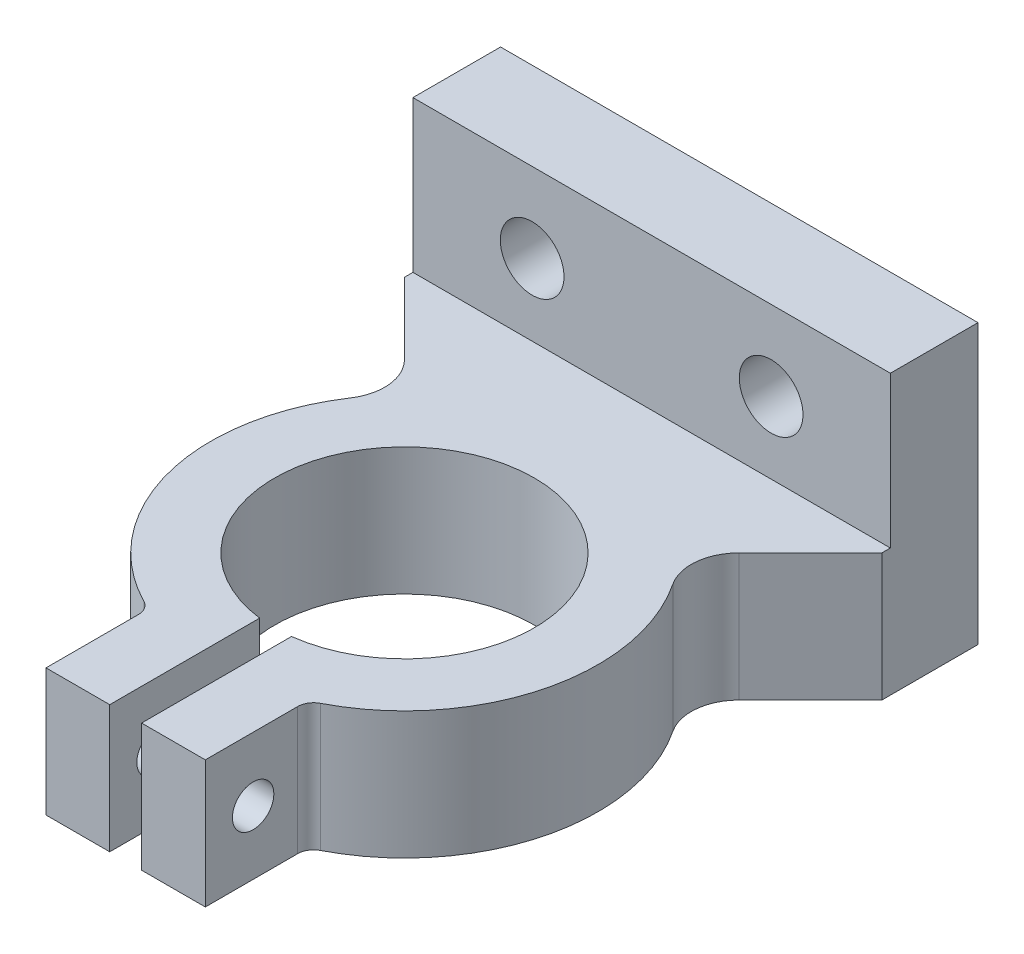
ISO-10303-21;
HEADER;
FILE_DESCRIPTION(('STEP AP214'),'2;1');
FILE_NAME('part.step','',(''),(''),'','','');
FILE_SCHEMA(('AUTOMOTIVE_DESIGN { 1 0 10303 214 1 1 1 1 }'));
ENDSEC;
DATA;
#1=APPLICATION_CONTEXT('core data for automotive mechanical design processes');
#2=APPLICATION_PROTOCOL_DEFINITION('international standard','automotive_design',2000,#1);
#3=PRODUCT_CONTEXT('',#1,'mechanical');
#4=PRODUCT('Part','Part','',(#3));
#5=PRODUCT_RELATED_PRODUCT_CATEGORY('part','',(#4));
#6=PRODUCT_DEFINITION_FORMATION('','',#4);
#7=PRODUCT_DEFINITION_CONTEXT('part definition',#1,'design');
#8=PRODUCT_DEFINITION('design','',#6,#7);
#9=PRODUCT_DEFINITION_SHAPE('','',#8);
#10=(LENGTH_UNIT() NAMED_UNIT(*) SI_UNIT(.MILLI.,.METRE.));
#11=(NAMED_UNIT(*) PLANE_ANGLE_UNIT() SI_UNIT($,.RADIAN.));
#12=(NAMED_UNIT(*) SI_UNIT($,.STERADIAN.) SOLID_ANGLE_UNIT());
#13=UNCERTAINTY_MEASURE_WITH_UNIT(LENGTH_MEASURE(1.E-05),#10,'distance_accuracy_value','');
#14=(GEOMETRIC_REPRESENTATION_CONTEXT(3) GLOBAL_UNCERTAINTY_ASSIGNED_CONTEXT((#13)) GLOBAL_UNIT_ASSIGNED_CONTEXT((#10,
#11,#12)) REPRESENTATION_CONTEXT('',''));
#15=CARTESIAN_POINT('',(0.,0.,0.));
#16=DIRECTION('',(0.,0.,1.));
#17=DIRECTION('',(1.,0.,0.));
#18=AXIS2_PLACEMENT_3D('',#15,#16,#17);
#19=CARTESIAN_POINT('',(0.,0.,0.));
#20=DIRECTION('',(0.,-1.,0.));
#21=DIRECTION('',(-1.,0.,0.));
#22=AXIS2_PLACEMENT_3D('',#19,#20,#21);
#23=PLANE('',#22);
#24=CARTESIAN_POINT('',(-25.2437120883597,0.,36.2415692858788));
#25=DIRECTION('',(0.,-1.,0.));
#26=DIRECTION('',(0.,0.,-1.));
#27=AXIS2_PLACEMENT_3D('',#24,#25,#26);
#28=CIRCLE('',#27,6.);
#29=CARTESIAN_POINT('',(-20.2449572193776,0.,39.560070417388));
#30=VERTEX_POINT('',#29);
#31=CARTESIAN_POINT('',(-21.0010714012405,0.,31.9989285987596));
#32=VERTEX_POINT('',#31);
#33=EDGE_CURVE('E344',#30,#32,#28,.F.);
#34=ORIENTED_EDGE('',*,*,#33,.T.);
#35=DIRECTION('',(-0.707106781186548,0.,-0.707106781186547));
#36=VECTOR('',#35,1.);
#37=CARTESIAN_POINT('',(-31.4662517628014,0.,21.5337482371987));
#38=LINE('',#37,#36);
#39=CARTESIAN_POINT('',(-29.9662517628014,0.,23.0337482371987));
#40=VERTEX_POINT('',#39);
#41=EDGE_CURVE('E230',#32,#40,#38,.T.);
#42=ORIENTED_EDGE('',*,*,#41,.T.);
#43=DIRECTION('',(0.,0.,-1.));
#44=VECTOR('',#43,1.);
#45=CARTESIAN_POINT('',(-29.9662517628014,0.,0.));
#46=LINE('',#45,#44);
#47=CARTESIAN_POINT('',(-29.9662517628014,0.,10.9737520097188));
#48=VERTEX_POINT('',#47);
#49=EDGE_CURVE('E367',#40,#48,#46,.T.);
#50=ORIENTED_EDGE('',*,*,#49,.T.);
#51=DIRECTION('',(-1.,0.,0.));
#52=VECTOR('',#51,1.);
#53=CARTESIAN_POINT('',(31.4662517628013,0.,10.9737520097188));
#54=LINE('',#53,#52);
#55=CARTESIAN_POINT('',(29.9662517628014,0.,10.9737520097188));
#56=VERTEX_POINT('',#55);
#57=EDGE_CURVE('E198',#56,#48,#54,.T.);
#58=ORIENTED_EDGE('',*,*,#57,.F.);
#59=DIRECTION('',(0.,0.,1.));
#60=VECTOR('',#59,1.);
#61=CARTESIAN_POINT('',(29.9662517628013,0.,0.));
#62=LINE('',#61,#60);
#63=CARTESIAN_POINT('',(29.9662517628014,0.,23.0337482371987));
#64=VERTEX_POINT('',#63);
#65=EDGE_CURVE('E446',#56,#64,#62,.T.);
#66=ORIENTED_EDGE('',*,*,#65,.T.);
#67=DIRECTION('',(0.707106781186548,0.,-0.707106781186547));
#68=VECTOR('',#67,1.);
#69=CARTESIAN_POINT('',(31.4662517628014,0.,21.5337482371987));
#70=LINE('',#69,#68);
#71=CARTESIAN_POINT('',(21.0010714012405,0.,31.9989285987596));
#72=VERTEX_POINT('',#71);
#73=EDGE_CURVE('E220',#72,#64,#70,.T.);
#74=ORIENTED_EDGE('',*,*,#73,.F.);
#75=CARTESIAN_POINT('',(25.2437120883597,0.,36.2415692858788));
#76=DIRECTION('',(0.,-1.,0.));
#77=DIRECTION('',(0.,0.,-1.));
#78=AXIS2_PLACEMENT_3D('',#75,#76,#77);
#79=CIRCLE('',#78,6.);
#80=CARTESIAN_POINT('',(20.2449572193776,0.,39.560070417388));
#81=VERTEX_POINT('',#80);
#82=EDGE_CURVE('E43',#72,#81,#79,.F.);
#83=ORIENTED_EDGE('',*,*,#82,.T.);
#84=CARTESIAN_POINT('',(0.,0.,53.));
#85=DIRECTION('',(0.,1.,0.));
#86=DIRECTION('',(0.,0.,1.));
#87=AXIS2_PLACEMENT_3D('',#84,#85,#86);
#88=CIRCLE('',#87,24.3);
#89=CARTESIAN_POINT('',(11.0874524714829,0.,74.6230987069987));
#90=VERTEX_POINT('',#89);
#91=EDGE_CURVE('E223',#90,#81,#88,.T.);
#92=ORIENTED_EDGE('',*,*,#91,.F.);
#93=CARTESIAN_POINT('',(12.,0.,76.4027776129245));
#94=DIRECTION('',(0.,-1.,0.));
#95=DIRECTION('',(0.,0.,-1.));
#96=AXIS2_PLACEMENT_3D('',#93,#94,#95);
#97=CIRCLE('',#96,2.);
#98=CARTESIAN_POINT('',(10.,0.,76.4027776129245));
#99=VERTEX_POINT('',#98);
#100=EDGE_CURVE('E295',#90,#99,#97,.F.);
#101=ORIENTED_EDGE('',*,*,#100,.T.);
#102=DIRECTION('',(0.,0.,-1.));
#103=VECTOR('',#102,1.);
#104=CARTESIAN_POINT('',(10.,0.,75.1470088273789));
#105=LINE('',#104,#103);
#106=CARTESIAN_POINT('',(10.,0.,88.));
#107=VERTEX_POINT('',#106);
#108=EDGE_CURVE('E333',#107,#99,#105,.T.);
#109=ORIENTED_EDGE('',*,*,#108,.F.);
#110=DIRECTION('',(1.,0.,0.));
#111=VECTOR('',#110,1.);
#112=CARTESIAN_POINT('',(2.,0.,88.));
#113=LINE('',#112,#111);
#114=CARTESIAN_POINT('',(2.,0.,88.));
#115=VERTEX_POINT('',#114);
#116=EDGE_CURVE('E245',#115,#107,#113,.T.);
#117=ORIENTED_EDGE('',*,*,#116,.F.);
#118=DIRECTION('',(0.,0.,1.));
#119=VECTOR('',#118,1.);
#120=CARTESIAN_POINT('',(2.,0.,69.1768352900065));
#121=LINE('',#120,#119);
#122=CARTESIAN_POINT('',(2.,0.,69.1768352900065));
#123=VERTEX_POINT('',#122);
#124=EDGE_CURVE('E260',#123,#115,#121,.T.);
#125=ORIENTED_EDGE('',*,*,#124,.F.);
#126=CARTESIAN_POINT('',(0.,0.,53.));
#127=DIRECTION('',(0.,-1.,0.));
#128=DIRECTION('',(0.,0.,1.));
#129=AXIS2_PLACEMENT_3D('',#126,#127,#128);
#130=CIRCLE('',#129,16.3);
#131=CARTESIAN_POINT('',(-2.,0.,69.1768352900065));
#132=VERTEX_POINT('',#131);
#133=EDGE_CURVE('E258',#132,#123,#130,.T.);
#134=ORIENTED_EDGE('',*,*,#133,.F.);
#135=DIRECTION('',(0.,0.,-1.));
#136=VECTOR('',#135,1.);
#137=CARTESIAN_POINT('',(-2.,0.,69.1768352900065));
#138=LINE('',#137,#136);
#139=CARTESIAN_POINT('',(-2.,0.,88.));
#140=VERTEX_POINT('',#139);
#141=EDGE_CURVE('E256',#140,#132,#138,.T.);
#142=ORIENTED_EDGE('',*,*,#141,.F.);
#143=DIRECTION('',(1.,0.,0.));
#144=VECTOR('',#143,1.);
#145=CARTESIAN_POINT('',(-31.4662517628014,0.,88.));
#146=LINE('',#145,#144);
#147=CARTESIAN_POINT('',(-10.,0.,88.));
#148=VERTEX_POINT('',#147);
#149=EDGE_CURVE('E241',#148,#140,#146,.T.);
#150=ORIENTED_EDGE('',*,*,#149,.F.);
#151=DIRECTION('',(0.,0.,-1.));
#152=VECTOR('',#151,1.);
#153=CARTESIAN_POINT('',(-10.,0.,75.1470088273789));
#154=LINE('',#153,#152);
#155=CARTESIAN_POINT('',(-10.,0.,76.4027776129245));
#156=VERTEX_POINT('',#155);
#157=EDGE_CURVE('E320',#148,#156,#154,.T.);
#158=ORIENTED_EDGE('',*,*,#157,.T.);
#159=CARTESIAN_POINT('',(-12.,0.,76.4027776129245));
#160=DIRECTION('',(0.,-1.,0.));
#161=DIRECTION('',(0.,0.,-1.));
#162=AXIS2_PLACEMENT_3D('',#159,#160,#161);
#163=CIRCLE('',#162,2.);
#164=CARTESIAN_POINT('',(-11.0874524714829,0.,74.6230987069987));
#165=VERTEX_POINT('',#164);
#166=EDGE_CURVE('E300',#156,#165,#163,.F.);
#167=ORIENTED_EDGE('',*,*,#166,.T.);
#168=CARTESIAN_POINT('',(0.,0.,53.));
#169=DIRECTION('',(0.,-1.,0.));
#170=DIRECTION('',(0.,0.,1.));
#171=AXIS2_PLACEMENT_3D('',#168,#169,#170);
#172=CIRCLE('',#171,24.3);
#173=EDGE_CURVE('E233',#165,#30,#172,.T.);
#174=ORIENTED_EDGE('',*,*,#173,.T.);
#175=EDGE_LOOP('',(#34,#42,#50,#58,#66,#74,#83,#92,#101,#109,#117,#125,#134,#142,#150,#158,#167,#174));
#176=FACE_BOUND('',#175,.T.);
#177=ADVANCED_FACE('F35',(#176),#23,.T.);
#178=CARTESIAN_POINT('',(0.,16.,53.));
#179=DIRECTION('',(0.,1.,0.));
#180=DIRECTION('',(0.,0.,1.));
#181=AXIS2_PLACEMENT_3D('',#178,#179,#180);
#182=PLANE('',#181);
#183=DIRECTION('',(0.,0.,1.));
#184=VECTOR('',#183,1.);
#185=CARTESIAN_POINT('',(-29.9662517628014,16.,53.));
#186=LINE('',#185,#184);
#187=CARTESIAN_POINT('',(-29.9662517628014,16.,21.9737520097188));
#188=VERTEX_POINT('',#187);
#189=CARTESIAN_POINT('',(-29.9662517628014,16.,23.0337482371987));
#190=VERTEX_POINT('',#189);
#191=EDGE_CURVE('E375',#188,#190,#186,.T.);
#192=ORIENTED_EDGE('',*,*,#191,.T.);
#193=DIRECTION('',(0.707106781186548,0.,0.707106781186547));
#194=VECTOR('',#193,1.);
#195=CARTESIAN_POINT('',(0.,16.,53.));
#196=LINE('',#195,#194);
#197=CARTESIAN_POINT('',(-21.0010714012405,16.,31.9989285987596));
#198=VERTEX_POINT('',#197);
#199=EDGE_CURVE('E275',#190,#198,#196,.T.);
#200=ORIENTED_EDGE('',*,*,#199,.T.);
#201=CARTESIAN_POINT('',(-25.2437120883597,16.,36.2415692858788));
#202=DIRECTION('',(0.,1.,0.));
#203=DIRECTION('',(0.,0.,1.));
#204=AXIS2_PLACEMENT_3D('',#201,#202,#203);
#205=CIRCLE('',#204,6.);
#206=CARTESIAN_POINT('',(-20.2449572193776,16.,39.560070417388));
#207=VERTEX_POINT('',#206);
#208=EDGE_CURVE('E347',#198,#207,#205,.F.);
#209=ORIENTED_EDGE('',*,*,#208,.T.);
#210=CARTESIAN_POINT('',(0.,16.,53.));
#211=DIRECTION('',(0.,1.,0.));
#212=DIRECTION('',(0.,0.,1.));
#213=AXIS2_PLACEMENT_3D('',#210,#211,#212);
#214=CIRCLE('',#213,24.3);
#215=CARTESIAN_POINT('',(-11.0874524714829,16.,74.6230987069987));
#216=VERTEX_POINT('',#215);
#217=EDGE_CURVE('E278',#207,#216,#214,.T.);
#218=ORIENTED_EDGE('',*,*,#217,.T.);
#219=CARTESIAN_POINT('',(-12.,16.,76.4027776129245));
#220=DIRECTION('',(0.,1.,0.));
#221=DIRECTION('',(0.,0.,1.));
#222=AXIS2_PLACEMENT_3D('',#219,#220,#221);
#223=CIRCLE('',#222,2.);
#224=CARTESIAN_POINT('',(-10.,16.,76.4027776129245));
#225=VERTEX_POINT('',#224);
#226=EDGE_CURVE('E183',#216,#225,#223,.F.);
#227=ORIENTED_EDGE('',*,*,#226,.T.);
#228=DIRECTION('',(0.,0.,1.));
#229=VECTOR('',#228,1.);
#230=CARTESIAN_POINT('',(-9.99999999999999,16.,53.));
#231=LINE('',#230,#229);
#232=CARTESIAN_POINT('',(-10.,16.,88.));
#233=VERTEX_POINT('',#232);
#234=EDGE_CURVE('E280',#225,#233,#231,.T.);
#235=ORIENTED_EDGE('',*,*,#234,.T.);
#236=DIRECTION('',(1.,0.,0.));
#237=VECTOR('',#236,1.);
#238=CARTESIAN_POINT('',(-31.4662517628014,16.,88.));
#239=LINE('',#238,#237);
#240=CARTESIAN_POINT('',(-2.,16.,88.));
#241=VERTEX_POINT('',#240);
#242=EDGE_CURVE('E242',#233,#241,#239,.T.);
#243=ORIENTED_EDGE('',*,*,#242,.T.);
#244=DIRECTION('',(0.,0.,-1.));
#245=VECTOR('',#244,1.);
#246=CARTESIAN_POINT('',(-2.,16.,69.1768352900065));
#247=LINE('',#246,#245);
#248=CARTESIAN_POINT('',(-2.,16.,69.1768352900065));
#249=VERTEX_POINT('',#248);
#250=EDGE_CURVE('E244',#241,#249,#247,.T.);
#251=ORIENTED_EDGE('',*,*,#250,.T.);
#252=CARTESIAN_POINT('',(0.,16.,53.));
#253=DIRECTION('',(0.,-1.,0.));
#254=DIRECTION('',(0.,0.,1.));
#255=AXIS2_PLACEMENT_3D('',#252,#253,#254);
#256=CIRCLE('',#255,16.3);
#257=CARTESIAN_POINT('',(2.,16.,69.1768352900065));
#258=VERTEX_POINT('',#257);
#259=EDGE_CURVE('E247',#249,#258,#256,.T.);
#260=ORIENTED_EDGE('',*,*,#259,.T.);
#261=DIRECTION('',(0.,0.,1.));
#262=VECTOR('',#261,1.);
#263=CARTESIAN_POINT('',(2.,16.,69.1768352900065));
#264=LINE('',#263,#262);
#265=CARTESIAN_POINT('',(2.,16.,88.));
#266=VERTEX_POINT('',#265);
#267=EDGE_CURVE('E249',#258,#266,#264,.T.);
#268=ORIENTED_EDGE('',*,*,#267,.T.);
#269=DIRECTION('',(1.,0.,0.));
#270=VECTOR('',#269,1.);
#271=CARTESIAN_POINT('',(2.,16.,88.));
#272=LINE('',#271,#270);
#273=CARTESIAN_POINT('',(10.,16.,88.));
#274=VERTEX_POINT('',#273);
#275=EDGE_CURVE('E251',#266,#274,#272,.T.);
#276=ORIENTED_EDGE('',*,*,#275,.T.);
#277=DIRECTION('',(0.,0.,1.));
#278=VECTOR('',#277,1.);
#279=CARTESIAN_POINT('',(9.99999999999999,16.,53.));
#280=LINE('',#279,#278);
#281=CARTESIAN_POINT('',(10.,16.,76.4027776129245));
#282=VERTEX_POINT('',#281);
#283=EDGE_CURVE('E326',#282,#274,#280,.T.);
#284=ORIENTED_EDGE('',*,*,#283,.F.);
#285=CARTESIAN_POINT('',(12.,16.,76.4027776129245));
#286=DIRECTION('',(0.,1.,0.));
#287=DIRECTION('',(0.,0.,1.));
#288=AXIS2_PLACEMENT_3D('',#285,#286,#287);
#289=CIRCLE('',#288,2.);
#290=CARTESIAN_POINT('',(11.0874524714829,16.,74.6230987069987));
#291=VERTEX_POINT('',#290);
#292=EDGE_CURVE('E297',#282,#291,#289,.F.);
#293=ORIENTED_EDGE('',*,*,#292,.T.);
#294=CARTESIAN_POINT('',(0.,16.,53.));
#295=DIRECTION('',(0.,1.,0.));
#296=DIRECTION('',(0.,0.,1.));
#297=AXIS2_PLACEMENT_3D('',#294,#295,#296);
#298=CIRCLE('',#297,24.3);
#299=CARTESIAN_POINT('',(20.2449572193776,16.,39.560070417388));
#300=VERTEX_POINT('',#299);
#301=EDGE_CURVE('E282',#300,#291,#298,.F.);
#302=ORIENTED_EDGE('',*,*,#301,.F.);
#303=CARTESIAN_POINT('',(25.2437120883597,16.,36.2415692858788));
#304=DIRECTION('',(0.,1.,0.));
#305=DIRECTION('',(0.,0.,1.));
#306=AXIS2_PLACEMENT_3D('',#303,#304,#305);
#307=CIRCLE('',#306,6.);
#308=CARTESIAN_POINT('',(21.0010714012405,16.,31.9989285987596));
#309=VERTEX_POINT('',#308);
#310=EDGE_CURVE('E11',#300,#309,#307,.F.);
#311=ORIENTED_EDGE('',*,*,#310,.T.);
#312=DIRECTION('',(-0.707106781186548,0.,0.707106781186547));
#313=VECTOR('',#312,1.);
#314=CARTESIAN_POINT('',(0.,16.,53.));
#315=LINE('',#314,#313);
#316=CARTESIAN_POINT('',(29.9662517628014,16.,23.0337482371987));
#317=VERTEX_POINT('',#316);
#318=EDGE_CURVE('E327',#317,#309,#315,.T.);
#319=ORIENTED_EDGE('',*,*,#318,.F.);
#320=DIRECTION('',(0.,0.,-1.));
#321=VECTOR('',#320,1.);
#322=CARTESIAN_POINT('',(29.9662517628014,16.,53.));
#323=LINE('',#322,#321);
#324=CARTESIAN_POINT('',(29.9662517628014,16.,21.9737520097188));
#325=VERTEX_POINT('',#324);
#326=EDGE_CURVE('E194',#317,#325,#323,.T.);
#327=ORIENTED_EDGE('',*,*,#326,.T.);
#328=DIRECTION('',(1.,0.,0.));
#329=VECTOR('',#328,1.);
#330=CARTESIAN_POINT('',(-45.4357365849655,16.,21.9737520097188));
#331=LINE('',#330,#329);
#332=EDGE_CURVE('E192',#188,#325,#331,.T.);
#333=ORIENTED_EDGE('',*,*,#332,.F.);
#334=EDGE_LOOP('',(#192,#200,#209,#218,#227,#235,#243,#251,#260,#268,#276,#284,#293,#302,#311,
#319,#327,#333));
#335=FACE_BOUND('',#334,.T.);
#336=ADVANCED_FACE('F305',(#335),#182,.T.);
#337=CARTESIAN_POINT('',(0.,0.,21.9737520097188));
#338=DIRECTION('',(0.,0.,-1.));
#339=DIRECTION('',(-1.,0.,0.));
#340=AXIS2_PLACEMENT_3D('',#337,#338,#339);
#341=PLANE('',#340);
#342=CARTESIAN_POINT('',(15.,25.,21.9737520097188));
#343=DIRECTION('',(0.,0.,-1.));
#344=DIRECTION('',(-1.,0.,0.));
#345=AXIS2_PLACEMENT_3D('',#342,#343,#344);
#346=CIRCLE('',#345,4.);
#347=CARTESIAN_POINT('',(11.,25.,21.9737520097188));
#348=VERTEX_POINT('',#347);
#349=EDGE_CURVE('E205',#348,#348,#346,.T.);
#350=ORIENTED_EDGE('',*,*,#349,.T.);
#351=EDGE_LOOP('',(#350));
#352=FACE_BOUND('',#351,.T.);
#353=CARTESIAN_POINT('',(-15.,25.,21.9737520097188));
#354=DIRECTION('',(0.,0.,-1.));
#355=DIRECTION('',(-1.,0.,0.));
#356=AXIS2_PLACEMENT_3D('',#353,#354,#355);
#357=CIRCLE('',#356,4.);
#358=CARTESIAN_POINT('',(-19.,25.,21.9737520097188));
#359=VERTEX_POINT('',#358);
#360=EDGE_CURVE('E378',#359,#359,#357,.T.);
#361=ORIENTED_EDGE('',*,*,#360,.T.);
#362=EDGE_LOOP('',(#361));
#363=FACE_BOUND('',#362,.T.);
#364=DIRECTION('',(0.,1.,0.));
#365=VECTOR('',#364,1.);
#366=CARTESIAN_POINT('',(-29.9662517628014,0.,21.9737520097188));
#367=LINE('',#366,#365);
#368=CARTESIAN_POINT('',(-29.9662517628014,35.,21.9737520097188));
#369=VERTEX_POINT('',#368);
#370=EDGE_CURVE('E363',#188,#369,#367,.T.);
#371=ORIENTED_EDGE('',*,*,#370,.F.);
#372=ORIENTED_EDGE('',*,*,#332,.T.);
#373=DIRECTION('',(0.,-1.,0.));
#374=VECTOR('',#373,1.);
#375=CARTESIAN_POINT('',(29.9662517628014,0.,21.9737520097188));
#376=LINE('',#375,#374);
#377=CARTESIAN_POINT('',(29.9662517628014,35.,21.9737520097188));
#378=VERTEX_POINT('',#377);
#379=EDGE_CURVE('E174',#378,#325,#376,.T.);
#380=ORIENTED_EDGE('',*,*,#379,.F.);
#381=DIRECTION('',(1.,0.,0.));
#382=VECTOR('',#381,1.);
#383=CARTESIAN_POINT('',(31.4662517628014,35.,21.9737520097188));
#384=LINE('',#383,#382);
#385=EDGE_CURVE('E190',#369,#378,#384,.T.);
#386=ORIENTED_EDGE('',*,*,#385,.F.);
#387=EDGE_LOOP('',(#371,#372,#380,#386));
#388=FACE_BOUND('',#387,.T.);
#389=ADVANCED_FACE('F189',(#352,#363,#388),#341,.F.);
#390=CARTESIAN_POINT('',(0.,0.,10.9737520097188));
#391=DIRECTION('',(0.,0.,-1.));
#392=DIRECTION('',(-1.,0.,0.));
#393=AXIS2_PLACEMENT_3D('',#390,#391,#392);
#394=PLANE('',#393);
#395=CARTESIAN_POINT('',(0.,10.,10.9737520097188));
#396=DIRECTION('',(0.,0.,-1.));
#397=DIRECTION('',(-1.,0.,0.));
#398=AXIS2_PLACEMENT_3D('',#395,#396,#397);
#399=CIRCLE('',#398,1.75);
#400=CARTESIAN_POINT('',(-1.75,10.,10.9737520097188));
#401=VERTEX_POINT('',#400);
#402=EDGE_CURVE('E444',#401,#401,#399,.T.);
#403=ORIENTED_EDGE('',*,*,#402,.F.);
#404=EDGE_LOOP('',(#403));
#405=FACE_BOUND('',#404,.T.);
#406=CARTESIAN_POINT('',(15.,25.,10.9737520097188));
#407=DIRECTION('',(0.,0.,-1.));
#408=DIRECTION('',(-1.,0.,0.));
#409=AXIS2_PLACEMENT_3D('',#406,#407,#408);
#410=CIRCLE('',#409,4.);
#411=CARTESIAN_POINT('',(11.,25.,10.9737520097188));
#412=VERTEX_POINT('',#411);
#413=EDGE_CURVE('E199',#412,#412,#410,.T.);
#414=ORIENTED_EDGE('',*,*,#413,.F.);
#415=EDGE_LOOP('',(#414));
#416=FACE_BOUND('',#415,.T.);
#417=CARTESIAN_POINT('',(-15.,25.,10.9737520097188));
#418=DIRECTION('',(0.,0.,-1.));
#419=DIRECTION('',(-1.,0.,0.));
#420=AXIS2_PLACEMENT_3D('',#417,#418,#419);
#421=CIRCLE('',#420,4.);
#422=CARTESIAN_POINT('',(-19.,25.,10.9737520097188));
#423=VERTEX_POINT('',#422);
#424=EDGE_CURVE('E379',#423,#423,#421,.T.);
#425=ORIENTED_EDGE('',*,*,#424,.F.);
#426=EDGE_LOOP('',(#425));
#427=FACE_BOUND('',#426,.T.);
#428=ORIENTED_EDGE('',*,*,#57,.T.);
#429=DIRECTION('',(0.,1.,0.));
#430=VECTOR('',#429,1.);
#431=CARTESIAN_POINT('',(-29.9662517628014,0.,10.9737520097188));
#432=LINE('',#431,#430);
#433=CARTESIAN_POINT('',(-29.9662517628014,35.,10.9737520097188));
#434=VERTEX_POINT('',#433);
#435=EDGE_CURVE('E193',#48,#434,#432,.T.);
#436=ORIENTED_EDGE('',*,*,#435,.T.);
#437=DIRECTION('',(1.,0.,0.));
#438=VECTOR('',#437,1.);
#439=CARTESIAN_POINT('',(31.4662517628014,35.,10.9737520097188));
#440=LINE('',#439,#438);
#441=CARTESIAN_POINT('',(29.9662517628014,35.,10.9737520097188));
#442=VERTEX_POINT('',#441);
#443=EDGE_CURVE('E202',#434,#442,#440,.T.);
#444=ORIENTED_EDGE('',*,*,#443,.T.);
#445=DIRECTION('',(0.,-1.,0.));
#446=VECTOR('',#445,1.);
#447=CARTESIAN_POINT('',(29.9662517628014,0.,10.9737520097188));
#448=LINE('',#447,#446);
#449=EDGE_CURVE('E177',#442,#56,#448,.T.);
#450=ORIENTED_EDGE('',*,*,#449,.T.);
#451=EDGE_LOOP('',(#428,#436,#444,#450));
#452=FACE_BOUND('',#451,.T.);
#453=ADVANCED_FACE('F365',(#405,#416,#427,#452),#394,.T.);
#454=CARTESIAN_POINT('',(31.4662517628014,35.,10.9737520097188));
#455=DIRECTION('',(0.,-1.,0.));
#456=DIRECTION('',(0.,0.,-1.));
#457=AXIS2_PLACEMENT_3D('',#454,#455,#456);
#458=PLANE('',#457);
#459=DIRECTION('',(0.,0.,-1.));
#460=VECTOR('',#459,1.);
#461=CARTESIAN_POINT('',(-29.9662517628014,35.,10.9737520097188));
#462=LINE('',#461,#460);
#463=EDGE_CURVE('E182',#369,#434,#462,.T.);
#464=ORIENTED_EDGE('',*,*,#463,.F.);
#465=ORIENTED_EDGE('',*,*,#385,.T.);
#466=DIRECTION('',(0.,0.,1.));
#467=VECTOR('',#466,1.);
#468=CARTESIAN_POINT('',(29.9662517628014,35.,10.9737520097188));
#469=LINE('',#468,#467);
#470=EDGE_CURVE('E170',#442,#378,#469,.T.);
#471=ORIENTED_EDGE('',*,*,#470,.F.);
#472=ORIENTED_EDGE('',*,*,#443,.F.);
#473=EDGE_LOOP('',(#464,#465,#471,#472));
#474=FACE_BOUND('',#473,.T.);
#475=ADVANCED_FACE('F197',(#474),#458,.F.);
#476=CARTESIAN_POINT('',(-31.4662517628014,16.,88.));
#477=DIRECTION('',(0.,0.,-1.));
#478=DIRECTION('',(-1.,0.,0.));
#479=AXIS2_PLACEMENT_3D('',#476,#477,#478);
#480=PLANE('',#479);
#481=DIRECTION('',(0.,-1.,0.));
#482=VECTOR('',#481,1.);
#483=CARTESIAN_POINT('',(-10.,60.,88.));
#484=LINE('',#483,#482);
#485=EDGE_CURVE('E232',#233,#148,#484,.T.);
#486=ORIENTED_EDGE('',*,*,#485,.T.);
#487=ORIENTED_EDGE('',*,*,#149,.T.);
#488=DIRECTION('',(0.,-1.,0.));
#489=VECTOR('',#488,1.);
#490=CARTESIAN_POINT('',(-2.,16.,88.));
#491=LINE('',#490,#489);
#492=EDGE_CURVE('E272',#241,#140,#491,.T.);
#493=ORIENTED_EDGE('',*,*,#492,.F.);
#494=ORIENTED_EDGE('',*,*,#242,.F.);
#495=EDGE_LOOP('',(#486,#487,#493,#494));
#496=FACE_BOUND('',#495,.T.);
#497=ADVANCED_FACE('F413',(#496),#480,.F.);
#498=CARTESIAN_POINT('',(-2.,16.,69.1768352900065));
#499=DIRECTION('',(-1.,0.,0.));
#500=DIRECTION('',(0.,0.,1.));
#501=AXIS2_PLACEMENT_3D('',#498,#499,#500);
#502=PLANE('',#501);
#503=CARTESIAN_POINT('',(-2.,8.,82.));
#504=DIRECTION('',(-1.,0.,0.));
#505=DIRECTION('',(0.,0.,1.));
#506=AXIS2_PLACEMENT_3D('',#503,#504,#505);
#507=CIRCLE('',#506,2.6);
#508=CARTESIAN_POINT('',(-2.,8.,84.6));
#509=VERTEX_POINT('',#508);
#510=EDGE_CURVE('E217',#509,#509,#507,.T.);
#511=ORIENTED_EDGE('',*,*,#510,.T.);
#512=EDGE_LOOP('',(#511));
#513=FACE_BOUND('',#512,.T.);
#514=ORIENTED_EDGE('',*,*,#141,.T.);
#515=DIRECTION('',(0.,-1.,0.));
#516=VECTOR('',#515,1.);
#517=CARTESIAN_POINT('',(-2.,16.,69.1768352900065));
#518=LINE('',#517,#516);
#519=EDGE_CURVE('E269',#249,#132,#518,.T.);
#520=ORIENTED_EDGE('',*,*,#519,.F.);
#521=ORIENTED_EDGE('',*,*,#250,.F.);
#522=ORIENTED_EDGE('',*,*,#492,.T.);
#523=EDGE_LOOP('',(#514,#520,#521,#522));
#524=FACE_BOUND('',#523,.T.);
#525=ADVANCED_FACE('F483',(#513,#524),#502,.F.);
#526=CARTESIAN_POINT('',(0.,16.,53.));
#527=DIRECTION('',(0.,-1.,0.));
#528=DIRECTION('',(0.,0.,-1.));
#529=AXIS2_PLACEMENT_3D('',#526,#527,#528);
#530=CYLINDRICAL_SURFACE('',#529,16.3);
#531=ORIENTED_EDGE('',*,*,#133,.T.);
#532=DIRECTION('',(0.,-1.,0.));
#533=VECTOR('',#532,1.);
#534=CARTESIAN_POINT('',(2.,16.,69.1768352900065));
#535=LINE('',#534,#533);
#536=EDGE_CURVE('E266',#258,#123,#535,.T.);
#537=ORIENTED_EDGE('',*,*,#536,.F.);
#538=ORIENTED_EDGE('',*,*,#259,.F.);
#539=ORIENTED_EDGE('',*,*,#519,.T.);
#540=EDGE_LOOP('',(#531,#537,#538,#539));
#541=FACE_BOUND('',#540,.T.);
#542=ADVANCED_FACE('F480',(#541),#530,.F.);
#543=CARTESIAN_POINT('',(2.,16.,69.1768352900065));
#544=DIRECTION('',(1.,0.,0.));
#545=DIRECTION('',(0.,0.,-1.));
#546=AXIS2_PLACEMENT_3D('',#543,#544,#545);
#547=PLANE('',#546);
#548=CARTESIAN_POINT('',(2.,8.,82.));
#549=DIRECTION('',(1.,0.,0.));
#550=DIRECTION('',(0.,0.,-1.));
#551=AXIS2_PLACEMENT_3D('',#548,#549,#550);
#552=CIRCLE('',#551,2.6);
#553=CARTESIAN_POINT('',(2.,8.,79.4));
#554=VERTEX_POINT('',#553);
#555=EDGE_CURVE('E214',#554,#554,#552,.T.);
#556=ORIENTED_EDGE('',*,*,#555,.T.);
#557=EDGE_LOOP('',(#556));
#558=FACE_BOUND('',#557,.T.);
#559=ORIENTED_EDGE('',*,*,#124,.T.);
#560=DIRECTION('',(0.,-1.,0.));
#561=VECTOR('',#560,1.);
#562=CARTESIAN_POINT('',(2.,16.,88.));
#563=LINE('',#562,#561);
#564=EDGE_CURVE('E254',#266,#115,#563,.T.);
#565=ORIENTED_EDGE('',*,*,#564,.F.);
#566=ORIENTED_EDGE('',*,*,#267,.F.);
#567=ORIENTED_EDGE('',*,*,#536,.T.);
#568=EDGE_LOOP('',(#559,#565,#566,#567));
#569=FACE_BOUND('',#568,.T.);
#570=ADVANCED_FACE('F476',(#558,#569),#547,.F.);
#571=CARTESIAN_POINT('',(2.,16.,88.));
#572=DIRECTION('',(0.,0.,-1.));
#573=DIRECTION('',(-1.,0.,0.));
#574=AXIS2_PLACEMENT_3D('',#571,#572,#573);
#575=PLANE('',#574);
#576=ORIENTED_EDGE('',*,*,#116,.T.);
#577=DIRECTION('',(0.,-1.,0.));
#578=VECTOR('',#577,1.);
#579=CARTESIAN_POINT('',(10.,60.,88.));
#580=LINE('',#579,#578);
#581=EDGE_CURVE('E332',#274,#107,#580,.T.);
#582=ORIENTED_EDGE('',*,*,#581,.F.);
#583=ORIENTED_EDGE('',*,*,#275,.F.);
#584=ORIENTED_EDGE('',*,*,#564,.T.);
#585=EDGE_LOOP('',(#576,#582,#583,#584));
#586=FACE_BOUND('',#585,.T.);
#587=ADVANCED_FACE('F471',(#586),#575,.F.);
#588=CARTESIAN_POINT('',(-10.,60.,75.1470088273789));
#589=DIRECTION('',(-1.,0.,0.));
#590=DIRECTION('',(0.,0.,1.));
#591=AXIS2_PLACEMENT_3D('',#588,#589,#590);
#592=PLANE('',#591);
#593=CARTESIAN_POINT('',(-10.,8.,82.));
#594=DIRECTION('',(-1.,0.,0.));
#595=DIRECTION('',(0.,0.,1.));
#596=AXIS2_PLACEMENT_3D('',#593,#594,#595);
#597=CIRCLE('',#596,2.6);
#598=CARTESIAN_POINT('',(-10.,8.,84.6));
#599=VERTEX_POINT('',#598);
#600=EDGE_CURVE('E211',#599,#599,#597,.T.);
#601=ORIENTED_EDGE('',*,*,#600,.F.);
#602=EDGE_LOOP('',(#601));
#603=FACE_BOUND('',#602,.T.);
#604=ORIENTED_EDGE('',*,*,#234,.F.);
#605=DIRECTION('',(0.,1.,0.));
#606=VECTOR('',#605,1.);
#607=CARTESIAN_POINT('',(-10.,0.,76.4027776129245));
#608=LINE('',#607,#606);
#609=EDGE_CURVE('E289',#225,#156,#608,.F.);
#610=ORIENTED_EDGE('',*,*,#609,.T.);
#611=ORIENTED_EDGE('',*,*,#157,.F.);
#612=ORIENTED_EDGE('',*,*,#485,.F.);
#613=EDGE_LOOP('',(#604,#610,#611,#612));
#614=FACE_BOUND('',#613,.T.);
#615=ADVANCED_FACE('F312',(#603,#614),#592,.T.);
#616=CARTESIAN_POINT('',(0.,60.,53.));
#617=DIRECTION('',(0.,-1.,0.));
#618=DIRECTION('',(0.,0.,-1.));
#619=AXIS2_PLACEMENT_3D('',#616,#617,#618);
#620=CYLINDRICAL_SURFACE('',#619,24.3);
#621=ORIENTED_EDGE('',*,*,#217,.F.);
#622=DIRECTION('',(0.,-1.,0.));
#623=VECTOR('',#622,1.);
#624=CARTESIAN_POINT('',(-20.2449572193776,60.,39.560070417388));
#625=LINE('',#624,#623);
#626=EDGE_CURVE('E325',#207,#30,#625,.T.);
#627=ORIENTED_EDGE('',*,*,#626,.T.);
#628=ORIENTED_EDGE('',*,*,#173,.F.);
#629=DIRECTION('',(0.,-1.,0.));
#630=VECTOR('',#629,1.);
#631=CARTESIAN_POINT('',(-11.0874524714829,60.,74.6230987069987));
#632=LINE('',#631,#630);
#633=EDGE_CURVE('E292',#165,#216,#632,.F.);
#634=ORIENTED_EDGE('',*,*,#633,.T.);
#635=EDGE_LOOP('',(#621,#627,#628,#634));
#636=FACE_BOUND('',#635,.T.);
#637=ADVANCED_FACE('F323',(#636),#620,.T.);
#638=CARTESIAN_POINT('',(-31.4662517628014,60.,21.5337482371987));
#639=DIRECTION('',(-0.707106781186547,0.,0.707106781186548));
#640=DIRECTION('',(0.707106781186548,0.,0.707106781186547));
#641=AXIS2_PLACEMENT_3D('',#638,#639,#640);
#642=PLANE('',#641);
#643=ORIENTED_EDGE('',*,*,#41,.F.);
#644=DIRECTION('',(0.,1.,0.));
#645=VECTOR('',#644,1.);
#646=CARTESIAN_POINT('',(-21.0010714012405,16.,31.9989285987596));
#647=LINE('',#646,#645);
#648=EDGE_CURVE('E349',#32,#198,#647,.T.);
#649=ORIENTED_EDGE('',*,*,#648,.T.);
#650=ORIENTED_EDGE('',*,*,#199,.F.);
#651=DIRECTION('',(0.,-1.,0.));
#652=VECTOR('',#651,1.);
#653=CARTESIAN_POINT('',(-29.9662517628014,60.,23.0337482371987));
#654=LINE('',#653,#652);
#655=EDGE_CURVE('E369',#190,#40,#654,.T.);
#656=ORIENTED_EDGE('',*,*,#655,.T.);
#657=EDGE_LOOP('',(#643,#649,#650,#656));
#658=FACE_BOUND('',#657,.T.);
#659=ADVANCED_FACE('F459',(#658),#642,.T.);
#660=CARTESIAN_POINT('',(31.4662517628014,60.,21.5337482371987));
#661=DIRECTION('',(-0.707106781186547,0.,-0.707106781186548));
#662=DIRECTION('',(-0.707106781186548,0.,0.707106781186547));
#663=AXIS2_PLACEMENT_3D('',#660,#661,#662);
#664=PLANE('',#663);
#665=ORIENTED_EDGE('',*,*,#318,.T.);
#666=DIRECTION('',(0.,1.,0.));
#667=VECTOR('',#666,1.);
#668=CARTESIAN_POINT('',(21.0010714012405,0.,31.9989285987596));
#669=LINE('',#668,#667);
#670=EDGE_CURVE('E345',#309,#72,#669,.F.);
#671=ORIENTED_EDGE('',*,*,#670,.T.);
#672=ORIENTED_EDGE('',*,*,#73,.T.);
#673=DIRECTION('',(0.,-1.,0.));
#674=VECTOR('',#673,1.);
#675=CARTESIAN_POINT('',(29.9662517628014,60.,23.0337482371987));
#676=LINE('',#675,#674);
#677=EDGE_CURVE('E453',#317,#64,#676,.T.);
#678=ORIENTED_EDGE('',*,*,#677,.F.);
#679=EDGE_LOOP('',(#665,#671,#672,#678));
#680=FACE_BOUND('',#679,.T.);
#681=ADVANCED_FACE('F456',(#680),#664,.F.);
#682=CARTESIAN_POINT('',(0.,60.,53.));
#683=DIRECTION('',(0.,-1.,0.));
#684=DIRECTION('',(0.,0.,-1.));
#685=AXIS2_PLACEMENT_3D('',#682,#683,#684);
#686=CYLINDRICAL_SURFACE('',#685,24.3);
#687=ORIENTED_EDGE('',*,*,#91,.T.);
#688=DIRECTION('',(0.,-1.,0.));
#689=VECTOR('',#688,1.);
#690=CARTESIAN_POINT('',(20.2449572193776,60.,39.560070417388));
#691=LINE('',#690,#689);
#692=EDGE_CURVE('E56',#81,#300,#691,.F.);
#693=ORIENTED_EDGE('',*,*,#692,.T.);
#694=ORIENTED_EDGE('',*,*,#301,.T.);
#695=DIRECTION('',(0.,-1.,0.));
#696=VECTOR('',#695,1.);
#697=CARTESIAN_POINT('',(11.0874524714829,60.,74.6230987069987));
#698=LINE('',#697,#696);
#699=EDGE_CURVE('E284',#291,#90,#698,.T.);
#700=ORIENTED_EDGE('',*,*,#699,.T.);
#701=EDGE_LOOP('',(#687,#693,#694,#700));
#702=FACE_BOUND('',#701,.T.);
#703=ADVANCED_FACE('F338',(#702),#686,.T.);
#704=CARTESIAN_POINT('',(10.,60.,75.1470088273789));
#705=DIRECTION('',(-1.,0.,0.));
#706=DIRECTION('',(0.,0.,1.));
#707=AXIS2_PLACEMENT_3D('',#704,#705,#706);
#708=PLANE('',#707);
#709=CARTESIAN_POINT('',(9.99999999999999,8.,82.));
#710=DIRECTION('',(-1.,0.,0.));
#711=DIRECTION('',(0.,0.,1.));
#712=AXIS2_PLACEMENT_3D('',#709,#710,#711);
#713=CIRCLE('',#712,2.6);
#714=CARTESIAN_POINT('',(9.99999999999999,8.,84.6));
#715=VERTEX_POINT('',#714);
#716=EDGE_CURVE('E210',#715,#715,#713,.T.);
#717=ORIENTED_EDGE('',*,*,#716,.T.);
#718=EDGE_LOOP('',(#717));
#719=FACE_BOUND('',#718,.T.);
#720=ORIENTED_EDGE('',*,*,#108,.T.);
#721=DIRECTION('',(0.,1.,0.));
#722=VECTOR('',#721,1.);
#723=CARTESIAN_POINT('',(10.,16.,76.4027776129245));
#724=LINE('',#723,#722);
#725=EDGE_CURVE('E287',#99,#282,#724,.T.);
#726=ORIENTED_EDGE('',*,*,#725,.T.);
#727=ORIENTED_EDGE('',*,*,#283,.T.);
#728=ORIENTED_EDGE('',*,*,#581,.T.);
#729=EDGE_LOOP('',(#720,#726,#727,#728));
#730=FACE_BOUND('',#729,.T.);
#731=ADVANCED_FACE('F418',(#719,#730),#708,.F.);
#732=CARTESIAN_POINT('',(12.,60.,76.4027776129245));
#733=DIRECTION('',(0.,-1.,0.));
#734=DIRECTION('',(0.,0.,-1.));
#735=AXIS2_PLACEMENT_3D('',#732,#733,#734);
#736=CYLINDRICAL_SURFACE('',#735,2.);
#737=ORIENTED_EDGE('',*,*,#292,.F.);
#738=ORIENTED_EDGE('',*,*,#725,.F.);
#739=ORIENTED_EDGE('',*,*,#100,.F.);
#740=ORIENTED_EDGE('',*,*,#699,.F.);
#741=EDGE_LOOP('',(#737,#738,#739,#740));
#742=FACE_BOUND('',#741,.T.);
#743=ADVANCED_FACE('F415',(#742),#736,.F.);
#744=CARTESIAN_POINT('',(-12.,60.,76.4027776129245));
#745=DIRECTION('',(0.,-1.,0.));
#746=DIRECTION('',(0.,0.,-1.));
#747=AXIS2_PLACEMENT_3D('',#744,#745,#746);
#748=CYLINDRICAL_SURFACE('',#747,2.);
#749=ORIENTED_EDGE('',*,*,#226,.F.);
#750=ORIENTED_EDGE('',*,*,#633,.F.);
#751=ORIENTED_EDGE('',*,*,#166,.F.);
#752=ORIENTED_EDGE('',*,*,#609,.F.);
#753=EDGE_LOOP('',(#749,#750,#751,#752));
#754=FACE_BOUND('',#753,.T.);
#755=ADVANCED_FACE('F315',(#754),#748,.F.);
#756=CARTESIAN_POINT('',(-31.4662517628014,8.,82.));
#757=DIRECTION('',(1.,0.,0.));
#758=DIRECTION('',(0.,0.,-1.));
#759=AXIS2_PLACEMENT_3D('',#756,#757,#758);
#760=CYLINDRICAL_SURFACE('',#759,2.6);
#761=ORIENTED_EDGE('',*,*,#716,.F.);
#762=EDGE_LOOP('',(#761));
#763=FACE_BOUND('',#762,.T.);
#764=ORIENTED_EDGE('',*,*,#555,.F.);
#765=EDGE_LOOP('',(#764));
#766=FACE_BOUND('',#765,.T.);
#767=ADVANCED_FACE('F401',(#763,#766),#760,.F.);
#768=ORIENTED_EDGE('',*,*,#600,.T.);
#769=EDGE_LOOP('',(#768));
#770=FACE_BOUND('',#769,.T.);
#771=ORIENTED_EDGE('',*,*,#510,.F.);
#772=EDGE_LOOP('',(#771));
#773=FACE_BOUND('',#772,.T.);
#774=ADVANCED_FACE('F392',(#770,#773),#760,.F.);
#775=CARTESIAN_POINT('',(15.,25.,10.9737520097188));
#776=DIRECTION('',(0.,0.,1.));
#777=DIRECTION('',(1.,0.,0.));
#778=AXIS2_PLACEMENT_3D('',#775,#776,#777);
#779=CYLINDRICAL_SURFACE('',#778,4.);
#780=ORIENTED_EDGE('',*,*,#413,.T.);
#781=EDGE_LOOP('',(#780));
#782=FACE_BOUND('',#781,.T.);
#783=ORIENTED_EDGE('',*,*,#349,.F.);
#784=EDGE_LOOP('',(#783));
#785=FACE_BOUND('',#784,.T.);
#786=ADVANCED_FACE('F389',(#782,#785),#779,.F.);
#787=CARTESIAN_POINT('',(-15.,25.,10.9737520097188));
#788=DIRECTION('',(0.,0.,1.));
#789=DIRECTION('',(1.,0.,0.));
#790=AXIS2_PLACEMENT_3D('',#787,#788,#789);
#791=CYLINDRICAL_SURFACE('',#790,4.);
#792=ORIENTED_EDGE('',*,*,#424,.T.);
#793=EDGE_LOOP('',(#792));
#794=FACE_BOUND('',#793,.T.);
#795=ORIENTED_EDGE('',*,*,#360,.F.);
#796=EDGE_LOOP('',(#795));
#797=FACE_BOUND('',#796,.T.);
#798=ADVANCED_FACE('F391',(#794,#797),#791,.F.);
#799=CARTESIAN_POINT('',(29.9662517628013,-5.00000000014378E-05,-9.74619107463093));
#800=DIRECTION('',(1.,0.,0.));
#801=DIRECTION('',(0.,0.,-1.));
#802=AXIS2_PLACEMENT_3D('',#799,#800,#801);
#803=PLANE('',#802);
#804=ORIENTED_EDGE('',*,*,#379,.T.);
#805=ORIENTED_EDGE('',*,*,#326,.F.);
#806=ORIENTED_EDGE('',*,*,#677,.T.);
#807=ORIENTED_EDGE('',*,*,#65,.F.);
#808=ORIENTED_EDGE('',*,*,#449,.F.);
#809=ORIENTED_EDGE('',*,*,#470,.T.);
#810=EDGE_LOOP('',(#804,#805,#806,#807,#808,#809));
#811=FACE_BOUND('',#810,.T.);
#812=ADVANCED_FACE('F172',(#811),#803,.T.);
#813=CARTESIAN_POINT('',(-29.9662517628014,-5.00000000014378E-05,-9.74619107463093));
#814=DIRECTION('',(-1.,0.,0.));
#815=DIRECTION('',(0.,0.,1.));
#816=AXIS2_PLACEMENT_3D('',#813,#814,#815);
#817=PLANE('',#816);
#818=ORIENTED_EDGE('',*,*,#370,.T.);
#819=ORIENTED_EDGE('',*,*,#463,.T.);
#820=ORIENTED_EDGE('',*,*,#435,.F.);
#821=ORIENTED_EDGE('',*,*,#49,.F.);
#822=ORIENTED_EDGE('',*,*,#655,.F.);
#823=ORIENTED_EDGE('',*,*,#191,.F.);
#824=EDGE_LOOP('',(#818,#819,#820,#821,#822,#823));
#825=FACE_BOUND('',#824,.T.);
#826=ADVANCED_FACE('F360',(#825),#817,.T.);
#827=CARTESIAN_POINT('',(-25.2437120883597,60.,36.2415692858788));
#828=DIRECTION('',(0.,-1.,0.));
#829=DIRECTION('',(0.,0.,-1.));
#830=AXIS2_PLACEMENT_3D('',#827,#828,#829);
#831=CYLINDRICAL_SURFACE('',#830,6.);
#832=ORIENTED_EDGE('',*,*,#208,.F.);
#833=ORIENTED_EDGE('',*,*,#648,.F.);
#834=ORIENTED_EDGE('',*,*,#33,.F.);
#835=ORIENTED_EDGE('',*,*,#626,.F.);
#836=EDGE_LOOP('',(#832,#833,#834,#835));
#837=FACE_BOUND('',#836,.T.);
#838=ADVANCED_FACE('F356',(#837),#831,.F.);
#839=CARTESIAN_POINT('',(25.2437120883597,60.,36.2415692858788));
#840=DIRECTION('',(0.,-1.,0.));
#841=DIRECTION('',(0.,0.,-1.));
#842=AXIS2_PLACEMENT_3D('',#839,#840,#841);
#843=CYLINDRICAL_SURFACE('',#842,6.);
#844=ORIENTED_EDGE('',*,*,#310,.F.);
#845=ORIENTED_EDGE('',*,*,#692,.F.);
#846=ORIENTED_EDGE('',*,*,#82,.F.);
#847=ORIENTED_EDGE('',*,*,#670,.F.);
#848=EDGE_LOOP('',(#844,#845,#846,#847));
#849=FACE_BOUND('',#848,.T.);
#850=ADVANCED_FACE('F37',(#849),#843,.F.);
#851=CARTESIAN_POINT('',(0.,10.,25.9737520097188));
#852=DIRECTION('',(0.,0.,-1.));
#853=DIRECTION('',(-1.,0.,0.));
#854=AXIS2_PLACEMENT_3D('',#851,#852,#853);
#855=CYLINDRICAL_SURFACE('',#854,1.75);
#856=CARTESIAN_POINT('',(0.,10.,25.9737520097188));
#857=DIRECTION('',(0.,0.,-1.));
#858=DIRECTION('',(-1.,0.,0.));
#859=AXIS2_PLACEMENT_3D('',#856,#857,#858);
#860=CIRCLE('',#859,1.75);
#861=CARTESIAN_POINT('',(-1.75,10.,25.9737520097188));
#862=VERTEX_POINT('',#861);
#863=EDGE_CURVE('E443',#862,#862,#860,.T.);
#864=ORIENTED_EDGE('',*,*,#863,.F.);
#865=EDGE_LOOP('',(#864));
#866=FACE_BOUND('',#865,.T.);
#867=ORIENTED_EDGE('',*,*,#402,.T.);
#868=EDGE_LOOP('',(#867));
#869=FACE_BOUND('',#868,.T.);
#870=ADVANCED_FACE('F426',(#866,#869),#855,.F.);
#871=CARTESIAN_POINT('',(0.,10.,25.9737520097188));
#872=DIRECTION('',(0.,0.,-1.));
#873=DIRECTION('',(-1.,0.,0.));
#874=AXIS2_PLACEMENT_3D('',#871,#872,#873);
#875=PLANE('',#874);
#876=ORIENTED_EDGE('',*,*,#863,.T.);
#877=EDGE_LOOP('',(#876));
#878=FACE_BOUND('',#877,.T.);
#879=ADVANCED_FACE('F435',(#878),#875,.T.);
#880=CLOSED_SHELL('',(#177,#336,#389,#453,#475,#497,#525,#542,#570,#587,#615,#637,#659,#681,
#703,#731,#743,#755,#767,#774,#786,#798,#812,#826,#838,#850,#870,#879));
#881=MANIFOLD_SOLID_BREP('B2',#880);
#882=ADVANCED_BREP_SHAPE_REPRESENTATION('',(#18,#881),#14);
#883=SHAPE_DEFINITION_REPRESENTATION(#9,#882);
ENDSEC;
END-ISO-10303-21;
